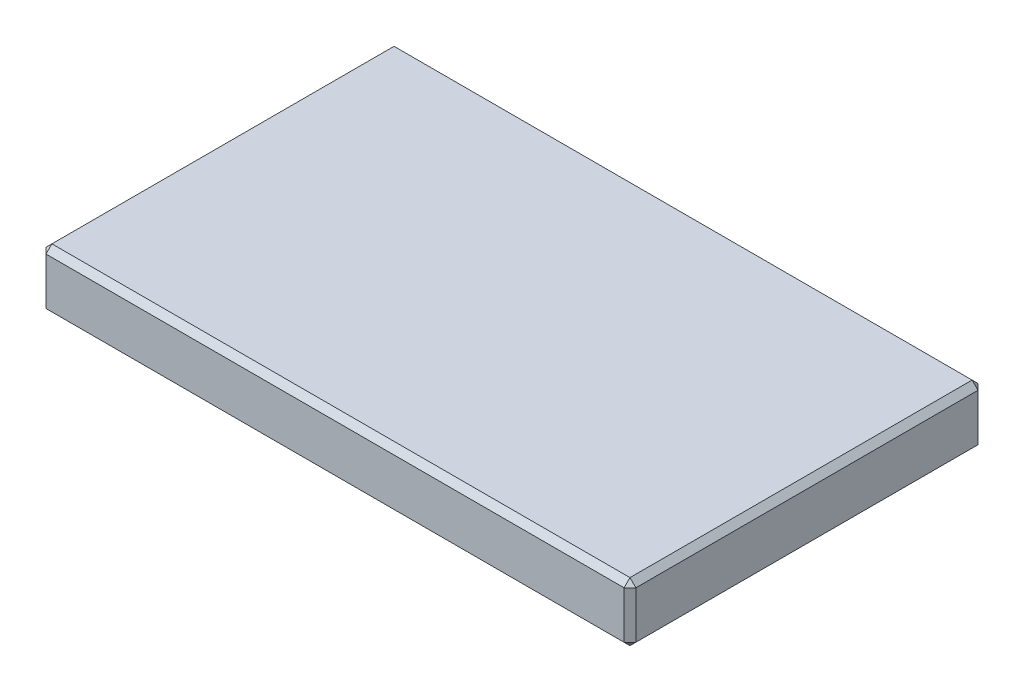
ISO-10303-21;
HEADER;
FILE_DESCRIPTION(('STEP AP214'),'2;1');
FILE_NAME('part.step','',(''),(''),'','','');
FILE_SCHEMA(('AUTOMOTIVE_DESIGN { 1 0 10303 214 1 1 1 1 }'));
ENDSEC;
DATA;
#1=APPLICATION_CONTEXT('core data for automotive mechanical design processes');
#2=APPLICATION_PROTOCOL_DEFINITION('international standard','automotive_design',2000,#1);
#3=PRODUCT_CONTEXT('',#1,'mechanical');
#4=PRODUCT('Part','Part','',(#3));
#5=PRODUCT_RELATED_PRODUCT_CATEGORY('part','',(#4));
#6=PRODUCT_DEFINITION_FORMATION('','',#4);
#7=PRODUCT_DEFINITION_CONTEXT('part definition',#1,'design');
#8=PRODUCT_DEFINITION('design','',#6,#7);
#9=PRODUCT_DEFINITION_SHAPE('','',#8);
#10=(LENGTH_UNIT() NAMED_UNIT(*) SI_UNIT(.MILLI.,.METRE.));
#11=(NAMED_UNIT(*) PLANE_ANGLE_UNIT() SI_UNIT($,.RADIAN.));
#12=(NAMED_UNIT(*) SI_UNIT($,.STERADIAN.) SOLID_ANGLE_UNIT());
#13=UNCERTAINTY_MEASURE_WITH_UNIT(LENGTH_MEASURE(1.E-05),#10,'distance_accuracy_value','');
#14=(GEOMETRIC_REPRESENTATION_CONTEXT(3) GLOBAL_UNCERTAINTY_ASSIGNED_CONTEXT((#13)) GLOBAL_UNIT_ASSIGNED_CONTEXT((#10,
#11,#12)) REPRESENTATION_CONTEXT('',''));
#15=CARTESIAN_POINT('',(0.,0.,0.));
#16=DIRECTION('',(0.,0.,1.));
#17=DIRECTION('',(1.,0.,0.));
#18=AXIS2_PLACEMENT_3D('',#15,#16,#17);
#19=CARTESIAN_POINT('',(-250.,50.,150.));
#20=DIRECTION('',(1.,0.,0.));
#21=DIRECTION('',(0.,0.,-1.));
#22=AXIS2_PLACEMENT_3D('',#19,#20,#21);
#23=PLANE('',#22);
#24=DIRECTION('',(0.,-1.,0.));
#25=VECTOR('',#24,1.);
#26=CARTESIAN_POINT('',(-250.,50.,-145.));
#27=LINE('',#26,#25);
#28=CARTESIAN_POINT('',(-250.,44.9999999999999,-145.));
#29=VERTEX_POINT('',#28);
#30=CARTESIAN_POINT('',(-250.,5.00000000000006,-145.));
#31=VERTEX_POINT('',#30);
#32=EDGE_CURVE('E196',#29,#31,#27,.T.);
#33=ORIENTED_EDGE('',*,*,#32,.T.);
#34=DIRECTION('',(0.,0.,1.));
#35=VECTOR('',#34,1.);
#36=CARTESIAN_POINT('',(-250.,5.00000000000006,150.));
#37=LINE('',#36,#35);
#38=CARTESIAN_POINT('',(-250.,5.00000000000006,145.));
#39=VERTEX_POINT('',#38);
#40=EDGE_CURVE('E198',#31,#39,#37,.T.);
#41=ORIENTED_EDGE('',*,*,#40,.T.);
#42=DIRECTION('',(0.,1.,0.));
#43=VECTOR('',#42,1.);
#44=CARTESIAN_POINT('',(-250.,50.,145.));
#45=LINE('',#44,#43);
#46=CARTESIAN_POINT('',(-250.,44.9999999999999,145.));
#47=VERTEX_POINT('',#46);
#48=EDGE_CURVE('E192',#39,#47,#45,.T.);
#49=ORIENTED_EDGE('',*,*,#48,.T.);
#50=DIRECTION('',(0.,0.,-1.));
#51=VECTOR('',#50,1.);
#52=CARTESIAN_POINT('',(-250.,44.9999999999999,-150.));
#53=LINE('',#52,#51);
#54=EDGE_CURVE('E194',#47,#29,#53,.T.);
#55=ORIENTED_EDGE('',*,*,#54,.T.);
#56=EDGE_LOOP('',(#33,#41,#49,#55));
#57=FACE_BOUND('',#56,.T.);
#58=ADVANCED_FACE('F36',(#57),#23,.F.);
#59=CARTESIAN_POINT('',(250.,50.,150.));
#60=DIRECTION('',(0.,0.,-1.));
#61=DIRECTION('',(-1.,0.,0.));
#62=AXIS2_PLACEMENT_3D('',#59,#60,#61);
#63=PLANE('',#62);
#64=DIRECTION('',(0.,-1.,0.));
#65=VECTOR('',#64,1.);
#66=CARTESIAN_POINT('',(-245.,50.,150.));
#67=LINE('',#66,#65);
#68=CARTESIAN_POINT('',(-245.,45.,150.));
#69=VERTEX_POINT('',#68);
#70=CARTESIAN_POINT('',(-245.,5.,150.));
#71=VERTEX_POINT('',#70);
#72=EDGE_CURVE('E129',#69,#71,#67,.T.);
#73=ORIENTED_EDGE('',*,*,#72,.T.);
#74=DIRECTION('',(1.,0.,0.));
#75=VECTOR('',#74,1.);
#76=CARTESIAN_POINT('',(250.,5.,150.));
#77=LINE('',#76,#75);
#78=CARTESIAN_POINT('',(245.,5.,150.));
#79=VERTEX_POINT('',#78);
#80=EDGE_CURVE('E163',#71,#79,#77,.T.);
#81=ORIENTED_EDGE('',*,*,#80,.T.);
#82=DIRECTION('',(0.,1.,0.));
#83=VECTOR('',#82,1.);
#84=CARTESIAN_POINT('',(245.,50.,150.));
#85=LINE('',#84,#83);
#86=CARTESIAN_POINT('',(245.,45.,150.));
#87=VERTEX_POINT('',#86);
#88=EDGE_CURVE('E132',#79,#87,#85,.T.);
#89=ORIENTED_EDGE('',*,*,#88,.T.);
#90=DIRECTION('',(-1.,0.,0.));
#91=VECTOR('',#90,1.);
#92=CARTESIAN_POINT('',(-250.,45.,150.));
#93=LINE('',#92,#91);
#94=EDGE_CURVE('E124',#87,#69,#93,.T.);
#95=ORIENTED_EDGE('',*,*,#94,.T.);
#96=EDGE_LOOP('',(#73,#81,#89,#95));
#97=FACE_BOUND('',#96,.T.);
#98=ADVANCED_FACE('F126',(#97),#63,.F.);
#99=CARTESIAN_POINT('',(250.,50.,150.));
#100=DIRECTION('',(-1.,0.,0.));
#101=DIRECTION('',(0.,0.,1.));
#102=AXIS2_PLACEMENT_3D('',#99,#100,#101);
#103=PLANE('',#102);
#104=DIRECTION('',(0.,-1.,0.));
#105=VECTOR('',#104,1.);
#106=CARTESIAN_POINT('',(250.,50.,145.));
#107=LINE('',#106,#105);
#108=CARTESIAN_POINT('',(250.,44.9999999999999,145.));
#109=VERTEX_POINT('',#108);
#110=CARTESIAN_POINT('',(250.,5.,145.));
#111=VERTEX_POINT('',#110);
#112=EDGE_CURVE('E174',#109,#111,#107,.T.);
#113=ORIENTED_EDGE('',*,*,#112,.T.);
#114=DIRECTION('',(0.,0.,-1.));
#115=VECTOR('',#114,1.);
#116=CARTESIAN_POINT('',(250.,5.,150.));
#117=LINE('',#116,#115);
#118=CARTESIAN_POINT('',(250.,5.,-145.));
#119=VERTEX_POINT('',#118);
#120=EDGE_CURVE('E180',#111,#119,#117,.T.);
#121=ORIENTED_EDGE('',*,*,#120,.T.);
#122=DIRECTION('',(0.,1.,0.));
#123=VECTOR('',#122,1.);
#124=CARTESIAN_POINT('',(250.,50.,-145.));
#125=LINE('',#124,#123);
#126=CARTESIAN_POINT('',(250.,44.9999999999999,-145.));
#127=VERTEX_POINT('',#126);
#128=EDGE_CURVE('E178',#119,#127,#125,.T.);
#129=ORIENTED_EDGE('',*,*,#128,.T.);
#130=DIRECTION('',(0.,0.,1.));
#131=VECTOR('',#130,1.);
#132=CARTESIAN_POINT('',(250.,44.9999999999999,150.));
#133=LINE('',#132,#131);
#134=EDGE_CURVE('E176',#127,#109,#133,.T.);
#135=ORIENTED_EDGE('',*,*,#134,.T.);
#136=EDGE_LOOP('',(#113,#121,#129,#135));
#137=FACE_BOUND('',#136,.T.);
#138=ADVANCED_FACE('F267',(#137),#103,.F.);
#139=CARTESIAN_POINT('',(250.,50.,-150.));
#140=DIRECTION('',(0.,0.,1.));
#141=DIRECTION('',(1.,0.,0.));
#142=AXIS2_PLACEMENT_3D('',#139,#140,#141);
#143=PLANE('',#142);
#144=DIRECTION('',(1.,0.,0.));
#145=VECTOR('',#144,1.);
#146=CARTESIAN_POINT('',(250.,44.9999999999999,-150.));
#147=LINE('',#146,#145);
#148=CARTESIAN_POINT('',(-245.,44.9999999999999,-150.));
#149=VERTEX_POINT('',#148);
#150=CARTESIAN_POINT('',(245.,44.9999999999999,-150.));
#151=VERTEX_POINT('',#150);
#152=EDGE_CURVE('E185',#149,#151,#147,.T.);
#153=ORIENTED_EDGE('',*,*,#152,.T.);
#154=DIRECTION('',(0.,-1.,0.));
#155=VECTOR('',#154,1.);
#156=CARTESIAN_POINT('',(245.,50.,-150.));
#157=LINE('',#156,#155);
#158=CARTESIAN_POINT('',(245.,5.,-150.));
#159=VERTEX_POINT('',#158);
#160=EDGE_CURVE('E190',#151,#159,#157,.T.);
#161=ORIENTED_EDGE('',*,*,#160,.T.);
#162=DIRECTION('',(-1.,0.,0.));
#163=VECTOR('',#162,1.);
#164=CARTESIAN_POINT('',(250.,5.,-150.));
#165=LINE('',#164,#163);
#166=CARTESIAN_POINT('',(-245.,5.,-150.));
#167=VERTEX_POINT('',#166);
#168=EDGE_CURVE('E187',#159,#167,#165,.T.);
#169=ORIENTED_EDGE('',*,*,#168,.T.);
#170=DIRECTION('',(0.,1.,0.));
#171=VECTOR('',#170,1.);
#172=CARTESIAN_POINT('',(-245.,50.,-150.));
#173=LINE('',#172,#171);
#174=EDGE_CURVE('E183',#167,#149,#173,.T.);
#175=ORIENTED_EDGE('',*,*,#174,.T.);
#176=EDGE_LOOP('',(#153,#161,#169,#175));
#177=FACE_BOUND('',#176,.T.);
#178=ADVANCED_FACE('F276',(#177),#143,.F.);
#179=CARTESIAN_POINT('',(0.,50.,0.));
#180=DIRECTION('',(0.,1.,0.));
#181=DIRECTION('',(0.,0.,1.));
#182=AXIS2_PLACEMENT_3D('',#179,#180,#181);
#183=PLANE('',#182);
#184=DIRECTION('',(0.,0.,-1.));
#185=VECTOR('',#184,1.);
#186=CARTESIAN_POINT('',(245.,50.,-150.));
#187=LINE('',#186,#185);
#188=CARTESIAN_POINT('',(245.,50.,145.));
#189=VERTEX_POINT('',#188);
#190=CARTESIAN_POINT('',(245.,50.,-145.));
#191=VERTEX_POINT('',#190);
#192=EDGE_CURVE('E46',#189,#191,#187,.T.);
#193=ORIENTED_EDGE('',*,*,#192,.T.);
#194=DIRECTION('',(-1.,0.,0.));
#195=VECTOR('',#194,1.);
#196=CARTESIAN_POINT('',(-250.,50.,-145.));
#197=LINE('',#196,#195);
#198=CARTESIAN_POINT('',(-245.,50.,-145.));
#199=VERTEX_POINT('',#198);
#200=EDGE_CURVE('E11',#191,#199,#197,.T.);
#201=ORIENTED_EDGE('',*,*,#200,.T.);
#202=DIRECTION('',(0.,0.,1.));
#203=VECTOR('',#202,1.);
#204=CARTESIAN_POINT('',(-245.,50.,150.));
#205=LINE('',#204,#203);
#206=CARTESIAN_POINT('',(-245.,50.,145.));
#207=VERTEX_POINT('',#206);
#208=EDGE_CURVE('E201',#199,#207,#205,.T.);
#209=ORIENTED_EDGE('',*,*,#208,.T.);
#210=DIRECTION('',(1.,0.,0.));
#211=VECTOR('',#210,1.);
#212=CARTESIAN_POINT('',(250.,50.,145.));
#213=LINE('',#212,#211);
#214=EDGE_CURVE('E57',#207,#189,#213,.T.);
#215=ORIENTED_EDGE('',*,*,#214,.T.);
#216=EDGE_LOOP('',(#193,#201,#209,#215));
#217=FACE_BOUND('',#216,.T.);
#218=ADVANCED_FACE('F298',(#217),#183,.T.);
#219=CARTESIAN_POINT('',(0.,0.,0.));
#220=DIRECTION('',(0.,1.,0.));
#221=DIRECTION('',(0.,0.,1.));
#222=AXIS2_PLACEMENT_3D('',#219,#220,#221);
#223=PLANE('',#222);
#224=DIRECTION('',(0.,0.,1.));
#225=VECTOR('',#224,1.);
#226=CARTESIAN_POINT('',(245.,0.,0.));
#227=LINE('',#226,#225);
#228=CARTESIAN_POINT('',(245.,0.,-145.));
#229=VERTEX_POINT('',#228);
#230=CARTESIAN_POINT('',(245.,0.,145.));
#231=VERTEX_POINT('',#230);
#232=EDGE_CURVE('E169',#229,#231,#227,.T.);
#233=ORIENTED_EDGE('',*,*,#232,.T.);
#234=DIRECTION('',(-1.,0.,0.));
#235=VECTOR('',#234,1.);
#236=CARTESIAN_POINT('',(0.,0.,145.));
#237=LINE('',#236,#235);
#238=CARTESIAN_POINT('',(-245.,0.,145.));
#239=VERTEX_POINT('',#238);
#240=EDGE_CURVE('E171',#231,#239,#237,.T.);
#241=ORIENTED_EDGE('',*,*,#240,.T.);
#242=DIRECTION('',(0.,0.,-1.));
#243=VECTOR('',#242,1.);
#244=CARTESIAN_POINT('',(-245.,0.,0.));
#245=LINE('',#244,#243);
#246=CARTESIAN_POINT('',(-245.,0.,-145.));
#247=VERTEX_POINT('',#246);
#248=EDGE_CURVE('E165',#239,#247,#245,.T.);
#249=ORIENTED_EDGE('',*,*,#248,.T.);
#250=DIRECTION('',(1.,0.,0.));
#251=VECTOR('',#250,1.);
#252=CARTESIAN_POINT('',(0.,0.,-145.));
#253=LINE('',#252,#251);
#254=EDGE_CURVE('E167',#247,#229,#253,.T.);
#255=ORIENTED_EDGE('',*,*,#254,.T.);
#256=EDGE_LOOP('',(#233,#241,#249,#255));
#257=FACE_BOUND('',#256,.T.);
#258=ADVANCED_FACE('F300',(#257),#223,.F.);
#259=CARTESIAN_POINT('',(0.,50.,-145.));
#260=DIRECTION('',(0.,0.707106781186543,-0.707106781186551));
#261=DIRECTION('',(1.,0.,0.));
#262=AXIS2_PLACEMENT_3D('',#259,#260,#261);
#263=PLANE('',#262);
#264=DIRECTION('',(0.,-0.707106781186551,-0.707106781186544));
#265=VECTOR('',#264,1.);
#266=CARTESIAN_POINT('',(-245.,50.,-145.));
#267=LINE('',#266,#265);
#268=EDGE_CURVE('E41',#199,#149,#267,.T.);
#269=ORIENTED_EDGE('',*,*,#268,.F.);
#270=ORIENTED_EDGE('',*,*,#200,.F.);
#271=DIRECTION('',(0.,0.707106781186551,0.707106781186543));
#272=VECTOR('',#271,1.);
#273=CARTESIAN_POINT('',(245.,44.9999999999999,-150.));
#274=LINE('',#273,#272);
#275=EDGE_CURVE('E160',#151,#191,#274,.T.);
#276=ORIENTED_EDGE('',*,*,#275,.F.);
#277=ORIENTED_EDGE('',*,*,#152,.F.);
#278=EDGE_LOOP('',(#269,#270,#276,#277));
#279=FACE_BOUND('',#278,.T.);
#280=ADVANCED_FACE('F39',(#279),#263,.T.);
#281=CARTESIAN_POINT('',(-245.,50.,-145.));
#282=DIRECTION('',(-0.577350269189635,0.577350269189619,-0.577350269189623));
#283=DIRECTION('',(-0.70710678118654,0.,0.707106781186555));
#284=AXIS2_PLACEMENT_3D('',#281,#282,#283);
#285=PLANE('',#284);
#286=DIRECTION('',(0.707106781186544,0.707106781186551,0.));
#287=VECTOR('',#286,1.);
#288=CARTESIAN_POINT('',(-245.,50.,-145.));
#289=LINE('',#288,#287);
#290=EDGE_CURVE('E247',#199,#29,#289,.F.);
#291=ORIENTED_EDGE('',*,*,#290,.F.);
#292=ORIENTED_EDGE('',*,*,#268,.T.);
#293=DIRECTION('',(0.70710678118654,0.,-0.707106781186555));
#294=VECTOR('',#293,1.);
#295=CARTESIAN_POINT('',(-247.5,44.9999999999999,-147.5));
#296=LINE('',#295,#294);
#297=EDGE_CURVE('E250',#29,#149,#296,.T.);
#298=ORIENTED_EDGE('',*,*,#297,.F.);
#299=EDGE_LOOP('',(#291,#292,#298));
#300=FACE_BOUND('',#299,.T.);
#301=ADVANCED_FACE('F294',(#300),#285,.T.);
#302=CARTESIAN_POINT('',(245.,44.9999999999999,-150.));
#303=DIRECTION('',(0.577350269189634,0.577350269189618,-0.577350269189625));
#304=DIRECTION('',(-0.707106781186542,0.,-0.707106781186553));
#305=AXIS2_PLACEMENT_3D('',#302,#303,#304);
#306=PLANE('',#305);
#307=DIRECTION('',(0.707106781186542,0.,0.707106781186553));
#308=VECTOR('',#307,1.);
#309=CARTESIAN_POINT('',(245.,44.9999999999999,-150.));
#310=LINE('',#309,#308);
#311=EDGE_CURVE('E241',#151,#127,#310,.T.);
#312=ORIENTED_EDGE('',*,*,#311,.F.);
#313=ORIENTED_EDGE('',*,*,#275,.T.);
#314=DIRECTION('',(0.707106781186544,-0.707106781186551,0.));
#315=VECTOR('',#314,1.);
#316=CARTESIAN_POINT('',(247.5,47.5,-145.));
#317=LINE('',#316,#315);
#318=EDGE_CURVE('E244',#127,#191,#317,.F.);
#319=ORIENTED_EDGE('',*,*,#318,.F.);
#320=EDGE_LOOP('',(#312,#313,#319));
#321=FACE_BOUND('',#320,.T.);
#322=ADVANCED_FACE('F257',(#321),#306,.T.);
#323=CARTESIAN_POINT('',(-250.,50.,-145.));
#324=DIRECTION('',(0.707106781186555,0.,0.70710678118654));
#325=DIRECTION('',(0.,-1.,0.));
#326=AXIS2_PLACEMENT_3D('',#323,#324,#325);
#327=PLANE('',#326);
#328=ORIENTED_EDGE('',*,*,#297,.T.);
#329=ORIENTED_EDGE('',*,*,#174,.F.);
#330=DIRECTION('',(-0.70710678118654,0.,0.707106781186555));
#331=VECTOR('',#330,1.);
#332=CARTESIAN_POINT('',(-245.,5.,-150.));
#333=LINE('',#332,#331);
#334=EDGE_CURVE('E236',#31,#167,#333,.F.);
#335=ORIENTED_EDGE('',*,*,#334,.F.);
#336=ORIENTED_EDGE('',*,*,#32,.F.);
#337=EDGE_LOOP('',(#328,#329,#335,#336));
#338=FACE_BOUND('',#337,.T.);
#339=ADVANCED_FACE('F288',(#338),#327,.F.);
#340=CARTESIAN_POINT('',(-245.,50.,0.));
#341=DIRECTION('',(-0.707106781186551,0.707106781186543,0.));
#342=DIRECTION('',(0.,0.,-1.));
#343=AXIS2_PLACEMENT_3D('',#340,#341,#342);
#344=PLANE('',#343);
#345=ORIENTED_EDGE('',*,*,#290,.T.);
#346=ORIENTED_EDGE('',*,*,#54,.F.);
#347=DIRECTION('',(-0.707106781186544,-0.707106781186551,0.));
#348=VECTOR('',#347,1.);
#349=CARTESIAN_POINT('',(-247.5,47.5,145.));
#350=LINE('',#349,#348);
#351=EDGE_CURVE('E144',#207,#47,#350,.T.);
#352=ORIENTED_EDGE('',*,*,#351,.F.);
#353=ORIENTED_EDGE('',*,*,#208,.F.);
#354=EDGE_LOOP('',(#345,#346,#352,#353));
#355=FACE_BOUND('',#354,.T.);
#356=ADVANCED_FACE('F297',(#355),#344,.T.);
#357=CARTESIAN_POINT('',(0.,50.,145.));
#358=DIRECTION('',(0.,0.707106781186551,0.707106781186543));
#359=DIRECTION('',(-1.,0.,0.));
#360=AXIS2_PLACEMENT_3D('',#357,#358,#359);
#361=PLANE('',#360);
#362=DIRECTION('',(0.,-0.707106781186544,0.707106781186552));
#363=VECTOR('',#362,1.);
#364=CARTESIAN_POINT('',(245.,47.5,147.5));
#365=LINE('',#364,#363);
#366=EDGE_CURVE('E145',#189,#87,#365,.T.);
#367=ORIENTED_EDGE('',*,*,#366,.F.);
#368=ORIENTED_EDGE('',*,*,#214,.F.);
#369=DIRECTION('',(0.,0.707106781186543,-0.707106781186551));
#370=VECTOR('',#369,1.);
#371=CARTESIAN_POINT('',(-245.,45.,150.));
#372=LINE('',#371,#370);
#373=EDGE_CURVE('E138',#69,#207,#372,.T.);
#374=ORIENTED_EDGE('',*,*,#373,.F.);
#375=ORIENTED_EDGE('',*,*,#94,.F.);
#376=EDGE_LOOP('',(#367,#368,#374,#375));
#377=FACE_BOUND('',#376,.T.);
#378=ADVANCED_FACE('F140',(#377),#361,.T.);
#379=CARTESIAN_POINT('',(245.,50.,0.));
#380=DIRECTION('',(0.707106781186551,0.707106781186543,0.));
#381=DIRECTION('',(0.,0.,1.));
#382=AXIS2_PLACEMENT_3D('',#379,#380,#381);
#383=PLANE('',#382);
#384=ORIENTED_EDGE('',*,*,#318,.T.);
#385=ORIENTED_EDGE('',*,*,#192,.F.);
#386=DIRECTION('',(-0.707106781186543,0.707106781186551,0.));
#387=VECTOR('',#386,1.);
#388=CARTESIAN_POINT('',(250.,44.9999999999999,145.));
#389=LINE('',#388,#387);
#390=EDGE_CURVE('E231',#109,#189,#389,.T.);
#391=ORIENTED_EDGE('',*,*,#390,.F.);
#392=ORIENTED_EDGE('',*,*,#134,.F.);
#393=EDGE_LOOP('',(#384,#385,#391,#392));
#394=FACE_BOUND('',#393,.T.);
#395=ADVANCED_FACE('F263',(#394),#383,.T.);
#396=CARTESIAN_POINT('',(245.,50.,-150.));
#397=DIRECTION('',(-0.707106781186553,0.,0.707106781186542));
#398=DIRECTION('',(0.,-1.,0.));
#399=AXIS2_PLACEMENT_3D('',#396,#397,#398);
#400=PLANE('',#399);
#401=ORIENTED_EDGE('',*,*,#311,.T.);
#402=ORIENTED_EDGE('',*,*,#128,.F.);
#403=DIRECTION('',(-0.707106781186542,0.,-0.707106781186553));
#404=VECTOR('',#403,1.);
#405=CARTESIAN_POINT('',(250.,5.,-145.));
#406=LINE('',#405,#404);
#407=EDGE_CURVE('E228',#159,#119,#406,.F.);
#408=ORIENTED_EDGE('',*,*,#407,.F.);
#409=ORIENTED_EDGE('',*,*,#160,.F.);
#410=EDGE_LOOP('',(#401,#402,#408,#409));
#411=FACE_BOUND('',#410,.T.);
#412=ADVANCED_FACE('F273',(#411),#400,.F.);
#413=CARTESIAN_POINT('',(250.,5.,-150.));
#414=DIRECTION('',(0.,0.707106781186551,0.707106781186543));
#415=DIRECTION('',(-1.,0.,0.));
#416=AXIS2_PLACEMENT_3D('',#413,#414,#415);
#417=PLANE('',#416);
#418=DIRECTION('',(0.,0.707106781186544,-0.707106781186551));
#419=VECTOR('',#418,1.);
#420=CARTESIAN_POINT('',(-245.,5.,-150.));
#421=LINE('',#420,#419);
#422=EDGE_CURVE('E238',#167,#247,#421,.F.);
#423=ORIENTED_EDGE('',*,*,#422,.F.);
#424=ORIENTED_EDGE('',*,*,#168,.F.);
#425=DIRECTION('',(0.,-0.707106781186544,0.707106781186551));
#426=VECTOR('',#425,1.);
#427=CARTESIAN_POINT('',(245.,2.49999999999999,-147.5));
#428=LINE('',#427,#426);
#429=EDGE_CURVE('E225',#229,#159,#428,.F.);
#430=ORIENTED_EDGE('',*,*,#429,.F.);
#431=ORIENTED_EDGE('',*,*,#254,.F.);
#432=EDGE_LOOP('',(#423,#424,#430,#431));
#433=FACE_BOUND('',#432,.T.);
#434=ADVANCED_FACE('F280',(#433),#417,.F.);
#435=CARTESIAN_POINT('',(-245.,5.,-150.));
#436=DIRECTION('',(-0.577350269189635,-0.577350269189626,-0.577350269189616));
#437=DIRECTION('',(0.707106781186542,-0.707106781186553,0.));
#438=AXIS2_PLACEMENT_3D('',#435,#436,#437);
#439=PLANE('',#438);
#440=ORIENTED_EDGE('',*,*,#334,.T.);
#441=ORIENTED_EDGE('',*,*,#422,.T.);
#442=DIRECTION('',(0.707106781186544,-0.707106781186551,0.));
#443=VECTOR('',#442,1.);
#444=CARTESIAN_POINT('',(-247.5,2.50000000000003,-145.));
#445=LINE('',#444,#443);
#446=EDGE_CURVE('E152',#31,#247,#445,.T.);
#447=ORIENTED_EDGE('',*,*,#446,.F.);
#448=EDGE_LOOP('',(#440,#441,#447));
#449=FACE_BOUND('',#448,.T.);
#450=ADVANCED_FACE('F385',(#449),#439,.T.);
#451=CARTESIAN_POINT('',(-245.,45.,150.));
#452=DIRECTION('',(-0.577350269189633,0.577350269189627,0.577350269189617));
#453=DIRECTION('',(-0.707106781186544,-0.707106781186551,0.));
#454=AXIS2_PLACEMENT_3D('',#451,#452,#453);
#455=PLANE('',#454);
#456=ORIENTED_EDGE('',*,*,#373,.T.);
#457=ORIENTED_EDGE('',*,*,#351,.T.);
#458=DIRECTION('',(-0.707106781186542,0.,-0.707106781186553));
#459=VECTOR('',#458,1.);
#460=CARTESIAN_POINT('',(-245.,45.,150.));
#461=LINE('',#460,#459);
#462=EDGE_CURVE('E148',#69,#47,#461,.T.);
#463=ORIENTED_EDGE('',*,*,#462,.F.);
#464=EDGE_LOOP('',(#456,#457,#463));
#465=FACE_BOUND('',#464,.T.);
#466=ADVANCED_FACE('F149',(#465),#455,.T.);
#467=CARTESIAN_POINT('',(250.,44.9999999999999,145.));
#468=DIRECTION('',(0.577350269189632,0.577350269189626,0.577350269189619));
#469=DIRECTION('',(-0.707106781186544,0.707106781186551,0.));
#470=AXIS2_PLACEMENT_3D('',#467,#468,#469);
#471=PLANE('',#470);
#472=ORIENTED_EDGE('',*,*,#390,.T.);
#473=ORIENTED_EDGE('',*,*,#366,.T.);
#474=DIRECTION('',(-0.707106781186544,0.,0.707106781186552));
#475=VECTOR('',#474,1.);
#476=CARTESIAN_POINT('',(250.,44.9999999999999,145.));
#477=LINE('',#476,#475);
#478=EDGE_CURVE('E153',#109,#87,#477,.T.);
#479=ORIENTED_EDGE('',*,*,#478,.F.);
#480=EDGE_LOOP('',(#472,#473,#479));
#481=FACE_BOUND('',#480,.T.);
#482=ADVANCED_FACE('F372',(#481),#471,.T.);
#483=CARTESIAN_POINT('',(250.,5.,-145.));
#484=DIRECTION('',(0.577350269189628,-0.577350269189631,-0.577350269189618));
#485=DIRECTION('',(0.707106781186549,0.707106781186546,0.));
#486=AXIS2_PLACEMENT_3D('',#483,#484,#485);
#487=PLANE('',#486);
#488=ORIENTED_EDGE('',*,*,#429,.T.);
#489=ORIENTED_EDGE('',*,*,#407,.T.);
#490=DIRECTION('',(0.707106781186551,0.707106781186543,0.));
#491=VECTOR('',#490,1.);
#492=CARTESIAN_POINT('',(250.,5.,-145.));
#493=LINE('',#492,#491);
#494=EDGE_CURVE('E219',#229,#119,#493,.T.);
#495=ORIENTED_EDGE('',*,*,#494,.F.);
#496=EDGE_LOOP('',(#488,#489,#495));
#497=FACE_BOUND('',#496,.T.);
#498=ADVANCED_FACE('F365',(#497),#487,.T.);
#499=CARTESIAN_POINT('',(-250.,5.00000000000006,150.));
#500=DIRECTION('',(0.707106781186551,0.707106781186543,0.));
#501=DIRECTION('',(0.,0.,1.));
#502=AXIS2_PLACEMENT_3D('',#499,#500,#501);
#503=PLANE('',#502);
#504=ORIENTED_EDGE('',*,*,#446,.T.);
#505=ORIENTED_EDGE('',*,*,#248,.F.);
#506=DIRECTION('',(-0.707106781186544,0.707106781186551,0.));
#507=VECTOR('',#506,1.);
#508=CARTESIAN_POINT('',(-245.,0.,145.));
#509=LINE('',#508,#507);
#510=EDGE_CURVE('E216',#39,#239,#509,.F.);
#511=ORIENTED_EDGE('',*,*,#510,.F.);
#512=ORIENTED_EDGE('',*,*,#40,.F.);
#513=EDGE_LOOP('',(#504,#505,#511,#512));
#514=FACE_BOUND('',#513,.T.);
#515=ADVANCED_FACE('F359',(#514),#503,.F.);
#516=CARTESIAN_POINT('',(-245.,50.,150.));
#517=DIRECTION('',(0.707106781186553,0.,-0.707106781186542));
#518=DIRECTION('',(0.,-1.,0.));
#519=AXIS2_PLACEMENT_3D('',#516,#517,#518);
#520=PLANE('',#519);
#521=ORIENTED_EDGE('',*,*,#462,.T.);
#522=ORIENTED_EDGE('',*,*,#48,.F.);
#523=DIRECTION('',(0.707106781186542,0.,0.707106781186553));
#524=VECTOR('',#523,1.);
#525=CARTESIAN_POINT('',(-247.5,5.00000000000003,147.5));
#526=LINE('',#525,#524);
#527=EDGE_CURVE('E156',#71,#39,#526,.F.);
#528=ORIENTED_EDGE('',*,*,#527,.F.);
#529=ORIENTED_EDGE('',*,*,#72,.F.);
#530=EDGE_LOOP('',(#521,#522,#528,#529));
#531=FACE_BOUND('',#530,.T.);
#532=ADVANCED_FACE('F155',(#531),#520,.F.);
#533=CARTESIAN_POINT('',(250.,50.,145.));
#534=DIRECTION('',(-0.707106781186551,0.,-0.707106781186543));
#535=DIRECTION('',(0.,-1.,0.));
#536=AXIS2_PLACEMENT_3D('',#533,#534,#535);
#537=PLANE('',#536);
#538=ORIENTED_EDGE('',*,*,#478,.T.);
#539=ORIENTED_EDGE('',*,*,#88,.F.);
#540=DIRECTION('',(0.707106781186544,0.,-0.707106781186552));
#541=VECTOR('',#540,1.);
#542=CARTESIAN_POINT('',(245.,5.,150.));
#543=LINE('',#542,#541);
#544=EDGE_CURVE('E212',#111,#79,#543,.F.);
#545=ORIENTED_EDGE('',*,*,#544,.F.);
#546=ORIENTED_EDGE('',*,*,#112,.F.);
#547=EDGE_LOOP('',(#538,#539,#545,#546));
#548=FACE_BOUND('',#547,.T.);
#549=ADVANCED_FACE('F346',(#548),#537,.F.);
#550=CARTESIAN_POINT('',(250.,5.,150.));
#551=DIRECTION('',(-0.707106781186543,0.707106781186551,0.));
#552=DIRECTION('',(0.,0.,-1.));
#553=AXIS2_PLACEMENT_3D('',#550,#551,#552);
#554=PLANE('',#553);
#555=ORIENTED_EDGE('',*,*,#494,.T.);
#556=ORIENTED_EDGE('',*,*,#120,.F.);
#557=DIRECTION('',(-0.707106781186551,-0.707106781186543,0.));
#558=VECTOR('',#557,1.);
#559=CARTESIAN_POINT('',(247.5,2.5,145.));
#560=LINE('',#559,#558);
#561=EDGE_CURVE('E209',#231,#111,#560,.F.);
#562=ORIENTED_EDGE('',*,*,#561,.F.);
#563=ORIENTED_EDGE('',*,*,#232,.F.);
#564=EDGE_LOOP('',(#555,#556,#562,#563));
#565=FACE_BOUND('',#564,.T.);
#566=ADVANCED_FACE('F339',(#565),#554,.F.);
#567=CARTESIAN_POINT('',(-245.,0.,145.));
#568=DIRECTION('',(-0.577350269189633,-0.577350269189627,0.577350269189617));
#569=DIRECTION('',(0.707106781186544,-0.707106781186551,0.));
#570=AXIS2_PLACEMENT_3D('',#567,#568,#569);
#571=PLANE('',#570);
#572=ORIENTED_EDGE('',*,*,#527,.T.);
#573=ORIENTED_EDGE('',*,*,#510,.T.);
#574=DIRECTION('',(0.,-0.707106781186543,-0.707106781186551));
#575=VECTOR('',#574,1.);
#576=CARTESIAN_POINT('',(-245.,0.,145.));
#577=LINE('',#576,#575);
#578=EDGE_CURVE('E207',#71,#239,#577,.T.);
#579=ORIENTED_EDGE('',*,*,#578,.F.);
#580=EDGE_LOOP('',(#572,#573,#579));
#581=FACE_BOUND('',#580,.T.);
#582=ADVANCED_FACE('F332',(#581),#571,.T.);
#583=CARTESIAN_POINT('',(245.,5.,150.));
#584=DIRECTION('',(0.577350269189626,-0.577350269189632,0.577350269189619));
#585=DIRECTION('',(0.707106781186551,0.707106781186544,0.));
#586=AXIS2_PLACEMENT_3D('',#583,#584,#585);
#587=PLANE('',#586);
#588=ORIENTED_EDGE('',*,*,#561,.T.);
#589=ORIENTED_EDGE('',*,*,#544,.T.);
#590=DIRECTION('',(0.,0.707106781186544,0.707106781186552));
#591=VECTOR('',#590,1.);
#592=CARTESIAN_POINT('',(245.,5.,150.));
#593=LINE('',#592,#591);
#594=EDGE_CURVE('E205',#231,#79,#593,.T.);
#595=ORIENTED_EDGE('',*,*,#594,.F.);
#596=EDGE_LOOP('',(#588,#589,#595));
#597=FACE_BOUND('',#596,.T.);
#598=ADVANCED_FACE('F325',(#597),#587,.T.);
#599=CARTESIAN_POINT('',(250.,5.,150.));
#600=DIRECTION('',(0.,0.707106781186551,-0.707106781186543));
#601=DIRECTION('',(1.,0.,0.));
#602=AXIS2_PLACEMENT_3D('',#599,#600,#601);
#603=PLANE('',#602);
#604=ORIENTED_EDGE('',*,*,#578,.T.);
#605=ORIENTED_EDGE('',*,*,#240,.F.);
#606=ORIENTED_EDGE('',*,*,#594,.T.);
#607=ORIENTED_EDGE('',*,*,#80,.F.);
#608=EDGE_LOOP('',(#604,#605,#606,#607));
#609=FACE_BOUND('',#608,.T.);
#610=ADVANCED_FACE('F319',(#609),#603,.F.);
#611=CLOSED_SHELL('',(#58,#98,#138,#178,#218,#258,#280,#301,#322,#339,#356,#378,#395,#412,#434,
#450,#466,#482,#498,#515,#532,#549,#566,#582,#598,#610));
#612=MANIFOLD_SOLID_BREP('B2',#611);
#613=ADVANCED_BREP_SHAPE_REPRESENTATION('',(#18,#612),#14);
#614=SHAPE_DEFINITION_REPRESENTATION(#9,#613);
ENDSEC;
END-ISO-10303-21;
